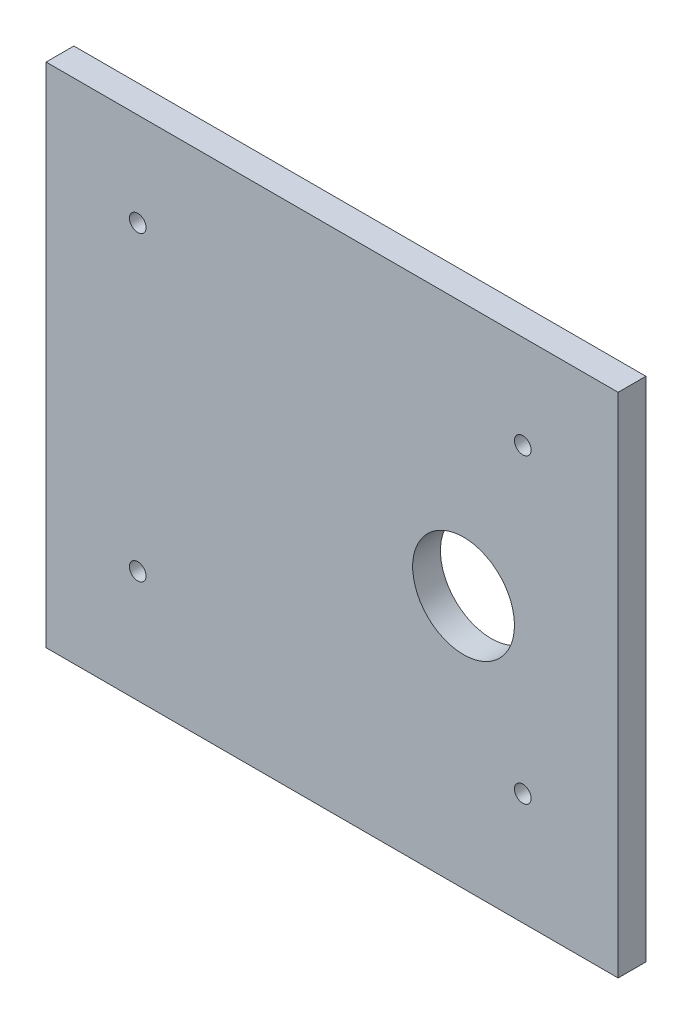
ISO-10303-21;
HEADER;
FILE_DESCRIPTION(('STEP AP214'),'2;1');
FILE_NAME('part.step','',(''),(''),'','','');
FILE_SCHEMA(('AUTOMOTIVE_DESIGN { 1 0 10303 214 1 1 1 1 }'));
ENDSEC;
DATA;
#1=APPLICATION_CONTEXT('core data for automotive mechanical design processes');
#2=APPLICATION_PROTOCOL_DEFINITION('international standard','automotive_design',2000,#1);
#3=PRODUCT_CONTEXT('',#1,'mechanical');
#4=PRODUCT('Part','Part','',(#3));
#5=PRODUCT_RELATED_PRODUCT_CATEGORY('part','',(#4));
#6=PRODUCT_DEFINITION_FORMATION('','',#4);
#7=PRODUCT_DEFINITION_CONTEXT('part definition',#1,'design');
#8=PRODUCT_DEFINITION('design','',#6,#7);
#9=PRODUCT_DEFINITION_SHAPE('','',#8);
#10=(LENGTH_UNIT() NAMED_UNIT(*) SI_UNIT(.MILLI.,.METRE.));
#11=(NAMED_UNIT(*) PLANE_ANGLE_UNIT() SI_UNIT($,.RADIAN.));
#12=(NAMED_UNIT(*) SI_UNIT($,.STERADIAN.) SOLID_ANGLE_UNIT());
#13=UNCERTAINTY_MEASURE_WITH_UNIT(LENGTH_MEASURE(1.E-05),#10,'distance_accuracy_value','');
#14=(GEOMETRIC_REPRESENTATION_CONTEXT(3) GLOBAL_UNCERTAINTY_ASSIGNED_CONTEXT((#13)) GLOBAL_UNIT_ASSIGNED_CONTEXT((#10,
#11,#12)) REPRESENTATION_CONTEXT('',''));
#15=CARTESIAN_POINT('',(0.,0.,0.));
#16=DIRECTION('',(0.,0.,1.));
#17=DIRECTION('',(1.,0.,0.));
#18=AXIS2_PLACEMENT_3D('',#15,#16,#17);
#19=CARTESIAN_POINT('',(0.,0.,15.));
#20=DIRECTION('',(0.,0.,-1.));
#21=DIRECTION('',(-1.,0.,0.));
#22=AXIS2_PLACEMENT_3D('',#19,#20,#21);
#23=PLANE('',#22);
#24=DIRECTION('',(1.,0.,0.));
#25=VECTOR('',#24,1.);
#26=CARTESIAN_POINT('',(0.,0.,15.));
#27=LINE('',#26,#25);
#28=CARTESIAN_POINT('',(-309.,0.,15.));
#29=VERTEX_POINT('',#28);
#30=CARTESIAN_POINT('',(0.,0.,15.));
#31=VERTEX_POINT('',#30);
#32=EDGE_CURVE('E98',#29,#31,#27,.T.);
#33=ORIENTED_EDGE('',*,*,#32,.T.);
#34=DIRECTION('',(0.,1.,0.));
#35=VECTOR('',#34,1.);
#36=CARTESIAN_POINT('',(0.,0.,15.));
#37=LINE('',#36,#35);
#38=CARTESIAN_POINT('',(0.,274.,15.));
#39=VERTEX_POINT('',#38);
#40=EDGE_CURVE('E93',#31,#39,#37,.T.);
#41=ORIENTED_EDGE('',*,*,#40,.T.);
#42=DIRECTION('',(-1.,0.,0.));
#43=VECTOR('',#42,1.);
#44=CARTESIAN_POINT('',(0.,274.,15.));
#45=LINE('',#44,#43);
#46=CARTESIAN_POINT('',(-309.,274.,15.));
#47=VERTEX_POINT('',#46);
#48=EDGE_CURVE('E96',#39,#47,#45,.T.);
#49=ORIENTED_EDGE('',*,*,#48,.T.);
#50=DIRECTION('',(0.,-1.,0.));
#51=VECTOR('',#50,1.);
#52=CARTESIAN_POINT('',(-309.,0.,15.));
#53=LINE('',#52,#51);
#54=EDGE_CURVE('E63',#47,#29,#53,.T.);
#55=ORIENTED_EDGE('',*,*,#54,.T.);
#56=EDGE_LOOP('',(#33,#41,#49,#55));
#57=FACE_BOUND('',#56,.T.);
#58=CARTESIAN_POINT('',(-83.5,137.,15.));
#59=DIRECTION('',(0.,0.,1.));
#60=DIRECTION('',(1.,0.,0.));
#61=AXIS2_PLACEMENT_3D('',#58,#59,#60);
#62=CIRCLE('',#61,27.5);
#63=CARTESIAN_POINT('',(-56.,137.,15.));
#64=VERTEX_POINT('',#63);
#65=EDGE_CURVE('E118',#64,#64,#62,.T.);
#66=ORIENTED_EDGE('',*,*,#65,.F.);
#67=EDGE_LOOP('',(#66));
#68=FACE_BOUND('',#67,.T.);
#69=CARTESIAN_POINT('',(-51.5,60.5,15.));
#70=DIRECTION('',(0.,0.,1.));
#71=DIRECTION('',(1.,0.,0.));
#72=AXIS2_PLACEMENT_3D('',#69,#70,#71);
#73=CIRCLE('',#72,4.50000000000001);
#74=CARTESIAN_POINT('',(-47.,60.5,15.));
#75=VERTEX_POINT('',#74);
#76=EDGE_CURVE('E140',#75,#75,#73,.T.);
#77=ORIENTED_EDGE('',*,*,#76,.F.);
#78=EDGE_LOOP('',(#77));
#79=FACE_BOUND('',#78,.T.);
#80=CARTESIAN_POINT('',(-51.5,223.5,15.));
#81=DIRECTION('',(0.,0.,1.));
#82=DIRECTION('',(1.,0.,0.));
#83=AXIS2_PLACEMENT_3D('',#80,#81,#82);
#84=CIRCLE('',#83,4.49999999999999);
#85=CARTESIAN_POINT('',(-47.,223.5,15.));
#86=VERTEX_POINT('',#85);
#87=EDGE_CURVE('E148',#86,#86,#84,.T.);
#88=ORIENTED_EDGE('',*,*,#87,.F.);
#89=EDGE_LOOP('',(#88));
#90=FACE_BOUND('',#89,.T.);
#91=CARTESIAN_POINT('',(-259.5,60.5,15.));
#92=DIRECTION('',(0.,0.,1.));
#93=DIRECTION('',(1.,0.,0.));
#94=AXIS2_PLACEMENT_3D('',#91,#92,#93);
#95=CIRCLE('',#94,4.50000000000001);
#96=CARTESIAN_POINT('',(-255.,60.5,15.));
#97=VERTEX_POINT('',#96);
#98=EDGE_CURVE('E156',#97,#97,#95,.T.);
#99=ORIENTED_EDGE('',*,*,#98,.F.);
#100=EDGE_LOOP('',(#99));
#101=FACE_BOUND('',#100,.T.);
#102=CARTESIAN_POINT('',(-259.5,223.5,15.));
#103=DIRECTION('',(0.,0.,1.));
#104=DIRECTION('',(1.,0.,0.));
#105=AXIS2_PLACEMENT_3D('',#102,#103,#104);
#106=CIRCLE('',#105,4.49999999999999);
#107=CARTESIAN_POINT('',(-255.,223.5,15.));
#108=VERTEX_POINT('',#107);
#109=EDGE_CURVE('E164',#108,#108,#106,.T.);
#110=ORIENTED_EDGE('',*,*,#109,.F.);
#111=EDGE_LOOP('',(#110));
#112=FACE_BOUND('',#111,.T.);
#113=ADVANCED_FACE('F45',(#57,#68,#79,#90,#101,#112),#23,.F.);
#114=CARTESIAN_POINT('',(0.,0.,0.));
#115=DIRECTION('',(0.,0.,-1.));
#116=DIRECTION('',(-1.,0.,0.));
#117=AXIS2_PLACEMENT_3D('',#114,#115,#116);
#118=PLANE('',#117);
#119=CARTESIAN_POINT('',(-259.5,60.5,0.));
#120=DIRECTION('',(0.,0.,1.));
#121=DIRECTION('',(1.,0.,0.));
#122=AXIS2_PLACEMENT_3D('',#119,#120,#121);
#123=CIRCLE('',#122,4.50000000000001);
#124=CARTESIAN_POINT('',(-255.,60.5,0.));
#125=VERTEX_POINT('',#124);
#126=EDGE_CURVE('E160',#125,#125,#123,.T.);
#127=ORIENTED_EDGE('',*,*,#126,.T.);
#128=EDGE_LOOP('',(#127));
#129=FACE_BOUND('',#128,.T.);
#130=CARTESIAN_POINT('',(-51.5,60.5,0.));
#131=DIRECTION('',(0.,0.,1.));
#132=DIRECTION('',(1.,0.,0.));
#133=AXIS2_PLACEMENT_3D('',#130,#131,#132);
#134=CIRCLE('',#133,4.50000000000001);
#135=CARTESIAN_POINT('',(-47.,60.5,0.));
#136=VERTEX_POINT('',#135);
#137=EDGE_CURVE('E144',#136,#136,#134,.T.);
#138=ORIENTED_EDGE('',*,*,#137,.T.);
#139=EDGE_LOOP('',(#138));
#140=FACE_BOUND('',#139,.T.);
#141=DIRECTION('',(1.,0.,0.));
#142=VECTOR('',#141,1.);
#143=CARTESIAN_POINT('',(0.,0.,0.));
#144=LINE('',#143,#142);
#145=CARTESIAN_POINT('',(-309.,0.,0.));
#146=VERTEX_POINT('',#145);
#147=CARTESIAN_POINT('',(0.,0.,0.));
#148=VERTEX_POINT('',#147);
#149=EDGE_CURVE('E114',#146,#148,#144,.T.);
#150=ORIENTED_EDGE('',*,*,#149,.F.);
#151=DIRECTION('',(0.,-1.,0.));
#152=VECTOR('',#151,1.);
#153=CARTESIAN_POINT('',(-309.,0.,0.));
#154=LINE('',#153,#152);
#155=CARTESIAN_POINT('',(-309.,274.,0.));
#156=VERTEX_POINT('',#155);
#157=EDGE_CURVE('E86',#156,#146,#154,.T.);
#158=ORIENTED_EDGE('',*,*,#157,.F.);
#159=DIRECTION('',(-1.,0.,0.));
#160=VECTOR('',#159,1.);
#161=CARTESIAN_POINT('',(0.,274.,0.));
#162=LINE('',#161,#160);
#163=CARTESIAN_POINT('',(0.,274.,0.));
#164=VERTEX_POINT('',#163);
#165=EDGE_CURVE('E80',#164,#156,#162,.T.);
#166=ORIENTED_EDGE('',*,*,#165,.F.);
#167=DIRECTION('',(0.,1.,0.));
#168=VECTOR('',#167,1.);
#169=CARTESIAN_POINT('',(0.,0.,0.));
#170=LINE('',#169,#168);
#171=EDGE_CURVE('E103',#148,#164,#170,.T.);
#172=ORIENTED_EDGE('',*,*,#171,.F.);
#173=EDGE_LOOP('',(#150,#158,#166,#172));
#174=FACE_BOUND('',#173,.T.);
#175=CARTESIAN_POINT('',(-83.5,137.,0.));
#176=DIRECTION('',(0.,0.,1.));
#177=DIRECTION('',(1.,0.,0.));
#178=AXIS2_PLACEMENT_3D('',#175,#176,#177);
#179=CIRCLE('',#178,27.5);
#180=CARTESIAN_POINT('',(-56.,137.,0.));
#181=VERTEX_POINT('',#180);
#182=EDGE_CURVE('E136',#181,#181,#179,.T.);
#183=ORIENTED_EDGE('',*,*,#182,.T.);
#184=EDGE_LOOP('',(#183));
#185=FACE_BOUND('',#184,.T.);
#186=CARTESIAN_POINT('',(-51.5,223.5,0.));
#187=DIRECTION('',(0.,0.,1.));
#188=DIRECTION('',(1.,0.,0.));
#189=AXIS2_PLACEMENT_3D('',#186,#187,#188);
#190=CIRCLE('',#189,4.49999999999999);
#191=CARTESIAN_POINT('',(-47.,223.5,0.));
#192=VERTEX_POINT('',#191);
#193=EDGE_CURVE('E152',#192,#192,#190,.T.);
#194=ORIENTED_EDGE('',*,*,#193,.T.);
#195=EDGE_LOOP('',(#194));
#196=FACE_BOUND('',#195,.T.);
#197=CARTESIAN_POINT('',(-259.5,223.5,0.));
#198=DIRECTION('',(0.,0.,1.));
#199=DIRECTION('',(1.,0.,0.));
#200=AXIS2_PLACEMENT_3D('',#197,#198,#199);
#201=CIRCLE('',#200,4.49999999999999);
#202=CARTESIAN_POINT('',(-255.,223.5,0.));
#203=VERTEX_POINT('',#202);
#204=EDGE_CURVE('E168',#203,#203,#201,.T.);
#205=ORIENTED_EDGE('',*,*,#204,.T.);
#206=EDGE_LOOP('',(#205));
#207=FACE_BOUND('',#206,.T.);
#208=ADVANCED_FACE('F131',(#129,#140,#174,#185,#196,#207),#118,.T.);
#209=CARTESIAN_POINT('',(0.,0.,15.));
#210=DIRECTION('',(0.,1.,0.));
#211=DIRECTION('',(0.,0.,1.));
#212=AXIS2_PLACEMENT_3D('',#209,#210,#211);
#213=PLANE('',#212);
#214=ORIENTED_EDGE('',*,*,#149,.T.);
#215=DIRECTION('',(0.,0.,-1.));
#216=VECTOR('',#215,1.);
#217=CARTESIAN_POINT('',(0.,0.,15.));
#218=LINE('',#217,#216);
#219=EDGE_CURVE('E11',#31,#148,#218,.T.);
#220=ORIENTED_EDGE('',*,*,#219,.F.);
#221=ORIENTED_EDGE('',*,*,#32,.F.);
#222=DIRECTION('',(0.,0.,-1.));
#223=VECTOR('',#222,1.);
#224=CARTESIAN_POINT('',(-309.,0.,15.));
#225=LINE('',#224,#223);
#226=EDGE_CURVE('E110',#29,#146,#225,.T.);
#227=ORIENTED_EDGE('',*,*,#226,.T.);
#228=EDGE_LOOP('',(#214,#220,#221,#227));
#229=FACE_BOUND('',#228,.T.);
#230=ADVANCED_FACE('F47',(#229),#213,.F.);
#231=CARTESIAN_POINT('',(0.,0.,15.));
#232=DIRECTION('',(-1.,0.,0.));
#233=DIRECTION('',(0.,0.,1.));
#234=AXIS2_PLACEMENT_3D('',#231,#232,#233);
#235=PLANE('',#234);
#236=ORIENTED_EDGE('',*,*,#171,.T.);
#237=DIRECTION('',(0.,0.,-1.));
#238=VECTOR('',#237,1.);
#239=CARTESIAN_POINT('',(0.,274.,15.));
#240=LINE('',#239,#238);
#241=EDGE_CURVE('E55',#39,#164,#240,.T.);
#242=ORIENTED_EDGE('',*,*,#241,.F.);
#243=ORIENTED_EDGE('',*,*,#40,.F.);
#244=ORIENTED_EDGE('',*,*,#219,.T.);
#245=EDGE_LOOP('',(#236,#242,#243,#244));
#246=FACE_BOUND('',#245,.T.);
#247=ADVANCED_FACE('F102',(#246),#235,.F.);
#248=CARTESIAN_POINT('',(0.,274.,15.));
#249=DIRECTION('',(0.,-1.,0.));
#250=DIRECTION('',(0.,0.,-1.));
#251=AXIS2_PLACEMENT_3D('',#248,#249,#250);
#252=PLANE('',#251);
#253=ORIENTED_EDGE('',*,*,#165,.T.);
#254=DIRECTION('',(0.,0.,-1.));
#255=VECTOR('',#254,1.);
#256=CARTESIAN_POINT('',(-309.,274.,15.));
#257=LINE('',#256,#255);
#258=EDGE_CURVE('E105',#47,#156,#257,.T.);
#259=ORIENTED_EDGE('',*,*,#258,.F.);
#260=ORIENTED_EDGE('',*,*,#48,.F.);
#261=ORIENTED_EDGE('',*,*,#241,.T.);
#262=EDGE_LOOP('',(#253,#259,#260,#261));
#263=FACE_BOUND('',#262,.T.);
#264=ADVANCED_FACE('F106',(#263),#252,.F.);
#265=CARTESIAN_POINT('',(-309.,0.,15.));
#266=DIRECTION('',(1.,0.,0.));
#267=DIRECTION('',(0.,0.,-1.));
#268=AXIS2_PLACEMENT_3D('',#265,#266,#267);
#269=PLANE('',#268);
#270=ORIENTED_EDGE('',*,*,#157,.T.);
#271=ORIENTED_EDGE('',*,*,#226,.F.);
#272=ORIENTED_EDGE('',*,*,#54,.F.);
#273=ORIENTED_EDGE('',*,*,#258,.T.);
#274=EDGE_LOOP('',(#270,#271,#272,#273));
#275=FACE_BOUND('',#274,.T.);
#276=ADVANCED_FACE('F128',(#275),#269,.F.);
#277=CARTESIAN_POINT('',(-83.5,137.,15.));
#278=DIRECTION('',(0.,0.,-1.));
#279=DIRECTION('',(-1.,0.,0.));
#280=AXIS2_PLACEMENT_3D('',#277,#278,#279);
#281=CYLINDRICAL_SURFACE('',#280,27.5);
#282=ORIENTED_EDGE('',*,*,#65,.T.);
#283=EDGE_LOOP('',(#282));
#284=FACE_BOUND('',#283,.T.);
#285=ORIENTED_EDGE('',*,*,#182,.F.);
#286=EDGE_LOOP('',(#285));
#287=FACE_BOUND('',#286,.T.);
#288=ADVANCED_FACE('F187',(#284,#287),#281,.F.);
#289=CARTESIAN_POINT('',(-51.5,60.5,15.));
#290=DIRECTION('',(0.,0.,-1.));
#291=DIRECTION('',(-1.,0.,0.));
#292=AXIS2_PLACEMENT_3D('',#289,#290,#291);
#293=CYLINDRICAL_SURFACE('',#292,4.50000000000001);
#294=ORIENTED_EDGE('',*,*,#76,.T.);
#295=EDGE_LOOP('',(#294));
#296=FACE_BOUND('',#295,.T.);
#297=ORIENTED_EDGE('',*,*,#137,.F.);
#298=EDGE_LOOP('',(#297));
#299=FACE_BOUND('',#298,.T.);
#300=ADVANCED_FACE('F232',(#296,#299),#293,.F.);
#301=CARTESIAN_POINT('',(-51.5,223.5,15.));
#302=DIRECTION('',(0.,0.,-1.));
#303=DIRECTION('',(-1.,0.,0.));
#304=AXIS2_PLACEMENT_3D('',#301,#302,#303);
#305=CYLINDRICAL_SURFACE('',#304,4.49999999999999);
#306=ORIENTED_EDGE('',*,*,#87,.T.);
#307=EDGE_LOOP('',(#306));
#308=FACE_BOUND('',#307,.T.);
#309=ORIENTED_EDGE('',*,*,#193,.F.);
#310=EDGE_LOOP('',(#309));
#311=FACE_BOUND('',#310,.T.);
#312=ADVANCED_FACE('F240',(#308,#311),#305,.F.);
#313=CARTESIAN_POINT('',(-259.5,60.5,15.));
#314=DIRECTION('',(0.,0.,-1.));
#315=DIRECTION('',(-1.,0.,0.));
#316=AXIS2_PLACEMENT_3D('',#313,#314,#315);
#317=CYLINDRICAL_SURFACE('',#316,4.50000000000001);
#318=ORIENTED_EDGE('',*,*,#98,.T.);
#319=EDGE_LOOP('',(#318));
#320=FACE_BOUND('',#319,.T.);
#321=ORIENTED_EDGE('',*,*,#126,.F.);
#322=EDGE_LOOP('',(#321));
#323=FACE_BOUND('',#322,.T.);
#324=ADVANCED_FACE('F248',(#320,#323),#317,.F.);
#325=CARTESIAN_POINT('',(-259.5,223.5,15.));
#326=DIRECTION('',(0.,0.,-1.));
#327=DIRECTION('',(-1.,0.,0.));
#328=AXIS2_PLACEMENT_3D('',#325,#326,#327);
#329=CYLINDRICAL_SURFACE('',#328,4.49999999999999);
#330=ORIENTED_EDGE('',*,*,#109,.T.);
#331=EDGE_LOOP('',(#330));
#332=FACE_BOUND('',#331,.T.);
#333=ORIENTED_EDGE('',*,*,#204,.F.);
#334=EDGE_LOOP('',(#333));
#335=FACE_BOUND('',#334,.T.);
#336=ADVANCED_FACE('F176',(#332,#335),#329,.F.);
#337=CLOSED_SHELL('',(#113,#208,#230,#247,#264,#276,#288,#300,#312,#324,#336));
#338=MANIFOLD_SOLID_BREP('B2',#337);
#339=ADVANCED_BREP_SHAPE_REPRESENTATION('',(#18,#338),#14);
#340=SHAPE_DEFINITION_REPRESENTATION(#9,#339);
ENDSEC;
END-ISO-10303-21;
